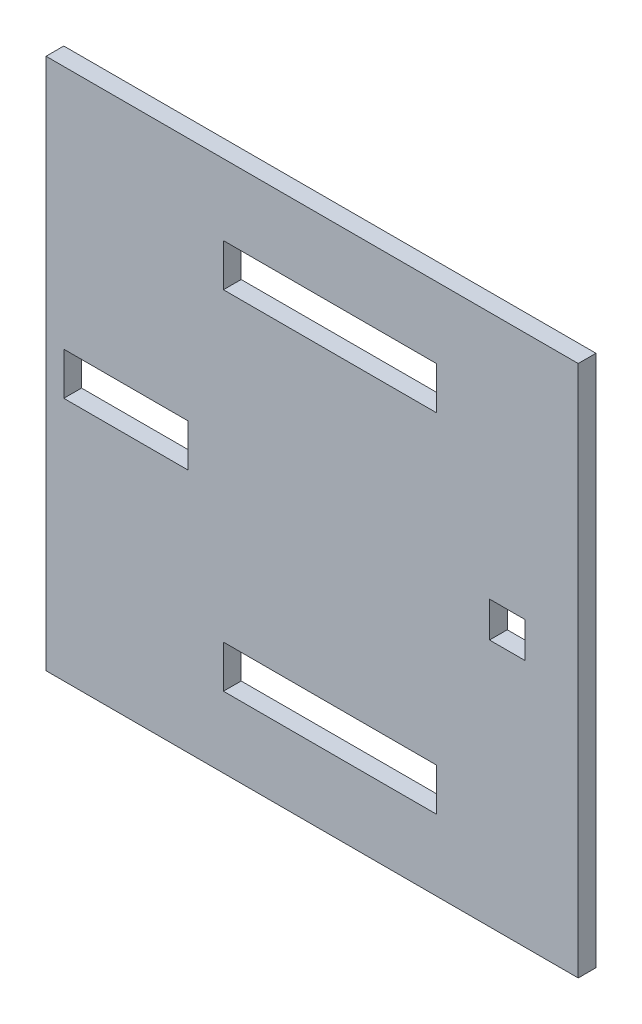
ISO-10303-21;
HEADER;
FILE_DESCRIPTION(('STEP AP214'),'2;1');
FILE_NAME('part.step','',(''),(''),'','','');
FILE_SCHEMA(('AUTOMOTIVE_DESIGN { 1 0 10303 214 1 1 1 1 }'));
ENDSEC;
DATA;
#1=APPLICATION_CONTEXT('core data for automotive mechanical design processes');
#2=APPLICATION_PROTOCOL_DEFINITION('international standard','automotive_design',2000,#1);
#3=PRODUCT_CONTEXT('',#1,'mechanical');
#4=PRODUCT('Part','Part','',(#3));
#5=PRODUCT_RELATED_PRODUCT_CATEGORY('part','',(#4));
#6=PRODUCT_DEFINITION_FORMATION('','',#4);
#7=PRODUCT_DEFINITION_CONTEXT('part definition',#1,'design');
#8=PRODUCT_DEFINITION('design','',#6,#7);
#9=PRODUCT_DEFINITION_SHAPE('','',#8);
#10=(LENGTH_UNIT() NAMED_UNIT(*) SI_UNIT(.MILLI.,.METRE.));
#11=(NAMED_UNIT(*) PLANE_ANGLE_UNIT() SI_UNIT($,.RADIAN.));
#12=(NAMED_UNIT(*) SI_UNIT($,.STERADIAN.) SOLID_ANGLE_UNIT());
#13=UNCERTAINTY_MEASURE_WITH_UNIT(LENGTH_MEASURE(1.E-05),#10,'distance_accuracy_value','');
#14=(GEOMETRIC_REPRESENTATION_CONTEXT(3) GLOBAL_UNCERTAINTY_ASSIGNED_CONTEXT((#13)) GLOBAL_UNIT_ASSIGNED_CONTEXT((#10,
#11,#12)) REPRESENTATION_CONTEXT('',''));
#15=CARTESIAN_POINT('',(0.,0.,0.));
#16=DIRECTION('',(0.,0.,1.));
#17=DIRECTION('',(1.,0.,0.));
#18=AXIS2_PLACEMENT_3D('',#15,#16,#17);
#19=CARTESIAN_POINT('',(75.,-75.,5.));
#20=DIRECTION('',(-1.,0.,0.));
#21=DIRECTION('',(0.,0.,1.));
#22=AXIS2_PLACEMENT_3D('',#19,#20,#21);
#23=PLANE('',#22);
#24=DIRECTION('',(0.,1.,0.));
#25=VECTOR('',#24,1.);
#26=CARTESIAN_POINT('',(75.,-75.,0.));
#27=LINE('',#26,#25);
#28=CARTESIAN_POINT('',(75.,-75.,0.));
#29=VERTEX_POINT('',#28);
#30=CARTESIAN_POINT('',(75.,75.,0.));
#31=VERTEX_POINT('',#30);
#32=EDGE_CURVE('E224',#29,#31,#27,.T.);
#33=ORIENTED_EDGE('',*,*,#32,.T.);
#34=DIRECTION('',(0.,0.,-1.));
#35=VECTOR('',#34,1.);
#36=CARTESIAN_POINT('',(75.,75.,5.));
#37=LINE('',#36,#35);
#38=CARTESIAN_POINT('',(75.,75.,5.));
#39=VERTEX_POINT('',#38);
#40=EDGE_CURVE('E319',#39,#31,#37,.T.);
#41=ORIENTED_EDGE('',*,*,#40,.F.);
#42=DIRECTION('',(0.,1.,0.));
#43=VECTOR('',#42,1.);
#44=CARTESIAN_POINT('',(75.,-75.,5.));
#45=LINE('',#44,#43);
#46=CARTESIAN_POINT('',(75.,-75.,5.));
#47=VERTEX_POINT('',#46);
#48=EDGE_CURVE('E293',#47,#39,#45,.T.);
#49=ORIENTED_EDGE('',*,*,#48,.F.);
#50=DIRECTION('',(0.,0.,-1.));
#51=VECTOR('',#50,1.);
#52=CARTESIAN_POINT('',(75.,-75.,5.));
#53=LINE('',#52,#51);
#54=EDGE_CURVE('E303',#47,#29,#53,.T.);
#55=ORIENTED_EDGE('',*,*,#54,.T.);
#56=EDGE_LOOP('',(#33,#41,#49,#55));
#57=FACE_BOUND('',#56,.T.);
#58=ADVANCED_FACE('F33',(#57),#23,.F.);
#59=CARTESIAN_POINT('',(-75.,75.,5.));
#60=DIRECTION('',(0.,-1.,0.));
#61=DIRECTION('',(0.,0.,-1.));
#62=AXIS2_PLACEMENT_3D('',#59,#60,#61);
#63=PLANE('',#62);
#64=DIRECTION('',(-1.,0.,0.));
#65=VECTOR('',#64,1.);
#66=CARTESIAN_POINT('',(-75.,75.,0.));
#67=LINE('',#66,#65);
#68=CARTESIAN_POINT('',(-75.,75.,0.));
#69=VERTEX_POINT('',#68);
#70=EDGE_CURVE('E306',#31,#69,#67,.T.);
#71=ORIENTED_EDGE('',*,*,#70,.T.);
#72=DIRECTION('',(0.,0.,-1.));
#73=VECTOR('',#72,1.);
#74=CARTESIAN_POINT('',(-75.,75.,5.));
#75=LINE('',#74,#73);
#76=CARTESIAN_POINT('',(-75.,75.,5.));
#77=VERTEX_POINT('',#76);
#78=EDGE_CURVE('E316',#77,#69,#75,.T.);
#79=ORIENTED_EDGE('',*,*,#78,.F.);
#80=DIRECTION('',(-1.,0.,0.));
#81=VECTOR('',#80,1.);
#82=CARTESIAN_POINT('',(-75.,75.,5.));
#83=LINE('',#82,#81);
#84=EDGE_CURVE('E296',#39,#77,#83,.T.);
#85=ORIENTED_EDGE('',*,*,#84,.F.);
#86=ORIENTED_EDGE('',*,*,#40,.T.);
#87=EDGE_LOOP('',(#71,#79,#85,#86));
#88=FACE_BOUND('',#87,.T.);
#89=ADVANCED_FACE('F347',(#88),#63,.F.);
#90=CARTESIAN_POINT('',(-75.,-75.,5.));
#91=DIRECTION('',(1.,0.,0.));
#92=DIRECTION('',(0.,0.,-1.));
#93=AXIS2_PLACEMENT_3D('',#90,#91,#92);
#94=PLANE('',#93);
#95=DIRECTION('',(0.,-1.,0.));
#96=VECTOR('',#95,1.);
#97=CARTESIAN_POINT('',(-75.,-75.,0.));
#98=LINE('',#97,#96);
#99=CARTESIAN_POINT('',(-75.,-75.,0.));
#100=VERTEX_POINT('',#99);
#101=EDGE_CURVE('E308',#69,#100,#98,.T.);
#102=ORIENTED_EDGE('',*,*,#101,.T.);
#103=DIRECTION('',(0.,0.,-1.));
#104=VECTOR('',#103,1.);
#105=CARTESIAN_POINT('',(-75.,-75.,5.));
#106=LINE('',#105,#104);
#107=CARTESIAN_POINT('',(-75.,-75.,5.));
#108=VERTEX_POINT('',#107);
#109=EDGE_CURVE('E313',#108,#100,#106,.T.);
#110=ORIENTED_EDGE('',*,*,#109,.F.);
#111=DIRECTION('',(0.,-1.,0.));
#112=VECTOR('',#111,1.);
#113=CARTESIAN_POINT('',(-75.,-75.,5.));
#114=LINE('',#113,#112);
#115=EDGE_CURVE('E299',#77,#108,#114,.T.);
#116=ORIENTED_EDGE('',*,*,#115,.F.);
#117=ORIENTED_EDGE('',*,*,#78,.T.);
#118=EDGE_LOOP('',(#102,#110,#116,#117));
#119=FACE_BOUND('',#118,.T.);
#120=ADVANCED_FACE('F352',(#119),#94,.F.);
#121=CARTESIAN_POINT('',(-75.,-75.,5.));
#122=DIRECTION('',(0.,1.,0.));
#123=DIRECTION('',(0.,0.,1.));
#124=AXIS2_PLACEMENT_3D('',#121,#122,#123);
#125=PLANE('',#124);
#126=DIRECTION('',(1.,0.,0.));
#127=VECTOR('',#126,1.);
#128=CARTESIAN_POINT('',(-75.,-75.,0.));
#129=LINE('',#128,#127);
#130=EDGE_CURVE('E297',#100,#29,#129,.T.);
#131=ORIENTED_EDGE('',*,*,#130,.T.);
#132=ORIENTED_EDGE('',*,*,#54,.F.);
#133=DIRECTION('',(1.,0.,0.));
#134=VECTOR('',#133,1.);
#135=CARTESIAN_POINT('',(-75.,-75.,5.));
#136=LINE('',#135,#134);
#137=EDGE_CURVE('E301',#108,#47,#136,.T.);
#138=ORIENTED_EDGE('',*,*,#137,.F.);
#139=ORIENTED_EDGE('',*,*,#109,.T.);
#140=EDGE_LOOP('',(#131,#132,#138,#139));
#141=FACE_BOUND('',#140,.T.);
#142=ADVANCED_FACE('F367',(#141),#125,.F.);
#143=CARTESIAN_POINT('',(0.,0.,5.));
#144=DIRECTION('',(0.,0.,-1.));
#145=DIRECTION('',(-1.,0.,0.));
#146=AXIS2_PLACEMENT_3D('',#143,#144,#145);
#147=PLANE('',#146);
#148=DIRECTION('',(-1.,0.,0.));
#149=VECTOR('',#148,1.);
#150=CARTESIAN_POINT('',(60.,4.99999999999996,5.));
#151=LINE('',#150,#149);
#152=CARTESIAN_POINT('',(60.,4.99999999999996,5.));
#153=VERTEX_POINT('',#152);
#154=CARTESIAN_POINT('',(50.,4.99999999999996,5.));
#155=VERTEX_POINT('',#154);
#156=EDGE_CURVE('E180',#153,#155,#151,.T.);
#157=ORIENTED_EDGE('',*,*,#156,.F.);
#158=DIRECTION('',(0.,1.,0.));
#159=VECTOR('',#158,1.);
#160=CARTESIAN_POINT('',(60.,4.99999999999996,5.));
#161=LINE('',#160,#159);
#162=CARTESIAN_POINT('',(60.,-5.00000000000004,5.));
#163=VERTEX_POINT('',#162);
#164=EDGE_CURVE('E47',#163,#153,#161,.T.);
#165=ORIENTED_EDGE('',*,*,#164,.F.);
#166=DIRECTION('',(1.,0.,0.));
#167=VECTOR('',#166,1.);
#168=CARTESIAN_POINT('',(60.,-5.00000000000004,5.));
#169=LINE('',#168,#167);
#170=CARTESIAN_POINT('',(50.,-5.00000000000004,5.));
#171=VERTEX_POINT('',#170);
#172=EDGE_CURVE('E187',#171,#163,#169,.T.);
#173=ORIENTED_EDGE('',*,*,#172,.F.);
#174=DIRECTION('',(0.,-1.,0.));
#175=VECTOR('',#174,1.);
#176=CARTESIAN_POINT('',(50.,4.99999999999996,5.));
#177=LINE('',#176,#175);
#178=EDGE_CURVE('E171',#155,#171,#177,.T.);
#179=ORIENTED_EDGE('',*,*,#178,.F.);
#180=EDGE_LOOP('',(#157,#165,#173,#179));
#181=FACE_BOUND('',#180,.T.);
#182=DIRECTION('',(-1.,0.,0.));
#183=VECTOR('',#182,1.);
#184=CARTESIAN_POINT('',(35.,55.,5.));
#185=LINE('',#184,#183);
#186=CARTESIAN_POINT('',(35.,55.,5.));
#187=VERTEX_POINT('',#186);
#188=CARTESIAN_POINT('',(-25.,55.,5.));
#189=VERTEX_POINT('',#188);
#190=EDGE_CURVE('E213',#187,#189,#185,.T.);
#191=ORIENTED_EDGE('',*,*,#190,.F.);
#192=DIRECTION('',(0.,1.,0.));
#193=VECTOR('',#192,1.);
#194=CARTESIAN_POINT('',(35.,55.,5.));
#195=LINE('',#194,#193);
#196=CARTESIAN_POINT('',(35.,43.,5.));
#197=VERTEX_POINT('',#196);
#198=EDGE_CURVE('E211',#197,#187,#195,.T.);
#199=ORIENTED_EDGE('',*,*,#198,.F.);
#200=DIRECTION('',(1.,0.,0.));
#201=VECTOR('',#200,1.);
#202=CARTESIAN_POINT('',(35.,43.,5.));
#203=LINE('',#202,#201);
#204=CARTESIAN_POINT('',(-25.,43.,5.));
#205=VERTEX_POINT('',#204);
#206=EDGE_CURVE('E201',#205,#197,#203,.T.);
#207=ORIENTED_EDGE('',*,*,#206,.F.);
#208=DIRECTION('',(0.,-1.,0.));
#209=VECTOR('',#208,1.);
#210=CARTESIAN_POINT('',(-25.,55.,5.));
#211=LINE('',#210,#209);
#212=EDGE_CURVE('E217',#189,#205,#211,.T.);
#213=ORIENTED_EDGE('',*,*,#212,.F.);
#214=EDGE_LOOP('',(#191,#199,#207,#213));
#215=FACE_BOUND('',#214,.T.);
#216=DIRECTION('',(-1.,0.,0.));
#217=VECTOR('',#216,1.);
#218=CARTESIAN_POINT('',(35.,-43.,5.));
#219=LINE('',#218,#217);
#220=CARTESIAN_POINT('',(35.,-43.,5.));
#221=VERTEX_POINT('',#220);
#222=CARTESIAN_POINT('',(-25.,-43.,5.));
#223=VERTEX_POINT('',#222);
#224=EDGE_CURVE('E247',#221,#223,#219,.T.);
#225=ORIENTED_EDGE('',*,*,#224,.F.);
#226=DIRECTION('',(0.,1.,0.));
#227=VECTOR('',#226,1.);
#228=CARTESIAN_POINT('',(35.,-43.,5.));
#229=LINE('',#228,#227);
#230=CARTESIAN_POINT('',(35.,-55.,5.));
#231=VERTEX_POINT('',#230);
#232=EDGE_CURVE('E245',#231,#221,#229,.T.);
#233=ORIENTED_EDGE('',*,*,#232,.F.);
#234=DIRECTION('',(1.,0.,0.));
#235=VECTOR('',#234,1.);
#236=CARTESIAN_POINT('',(35.,-55.,5.));
#237=LINE('',#236,#235);
#238=CARTESIAN_POINT('',(-25.,-55.,5.));
#239=VERTEX_POINT('',#238);
#240=EDGE_CURVE('E235',#239,#231,#237,.T.);
#241=ORIENTED_EDGE('',*,*,#240,.F.);
#242=DIRECTION('',(0.,-1.,0.));
#243=VECTOR('',#242,1.);
#244=CARTESIAN_POINT('',(-25.,-43.,5.));
#245=LINE('',#244,#243);
#246=EDGE_CURVE('E251',#223,#239,#245,.T.);
#247=ORIENTED_EDGE('',*,*,#246,.F.);
#248=EDGE_LOOP('',(#225,#233,#241,#247));
#249=FACE_BOUND('',#248,.T.);
#250=DIRECTION('',(-1.,0.,0.));
#251=VECTOR('',#250,1.);
#252=CARTESIAN_POINT('',(-35.,5.99999999999998,5.));
#253=LINE('',#252,#251);
#254=CARTESIAN_POINT('',(-35.,5.99999999999998,5.));
#255=VERTEX_POINT('',#254);
#256=CARTESIAN_POINT('',(-70.,5.99999999999997,5.));
#257=VERTEX_POINT('',#256);
#258=EDGE_CURVE('E278',#255,#257,#253,.T.);
#259=ORIENTED_EDGE('',*,*,#258,.F.);
#260=DIRECTION('',(0.,1.,0.));
#261=VECTOR('',#260,1.);
#262=CARTESIAN_POINT('',(-35.,5.99999999999998,5.));
#263=LINE('',#262,#261);
#264=CARTESIAN_POINT('',(-35.,-6.00000000000002,5.));
#265=VERTEX_POINT('',#264);
#266=EDGE_CURVE('E194',#265,#255,#263,.T.);
#267=ORIENTED_EDGE('',*,*,#266,.F.);
#268=DIRECTION('',(1.,0.,0.));
#269=VECTOR('',#268,1.);
#270=CARTESIAN_POINT('',(-35.,-6.00000000000002,5.));
#271=LINE('',#270,#269);
#272=CARTESIAN_POINT('',(-70.,-6.00000000000003,5.));
#273=VERTEX_POINT('',#272);
#274=EDGE_CURVE('E267',#273,#265,#271,.T.);
#275=ORIENTED_EDGE('',*,*,#274,.F.);
#276=DIRECTION('',(0.,-1.,0.));
#277=VECTOR('',#276,1.);
#278=CARTESIAN_POINT('',(-70.,5.99999999999997,5.));
#279=LINE('',#278,#277);
#280=EDGE_CURVE('E281',#257,#273,#279,.T.);
#281=ORIENTED_EDGE('',*,*,#280,.F.);
#282=EDGE_LOOP('',(#259,#267,#275,#281));
#283=FACE_BOUND('',#282,.T.);
#284=ORIENTED_EDGE('',*,*,#48,.T.);
#285=ORIENTED_EDGE('',*,*,#84,.T.);
#286=ORIENTED_EDGE('',*,*,#115,.T.);
#287=ORIENTED_EDGE('',*,*,#137,.T.);
#288=EDGE_LOOP('',(#284,#285,#286,#287));
#289=FACE_BOUND('',#288,.T.);
#290=ADVANCED_FACE('F184',(#181,#215,#249,#283,#289),#147,.F.);
#291=CARTESIAN_POINT('',(0.,0.,0.));
#292=DIRECTION('',(0.,0.,-1.));
#293=DIRECTION('',(-1.,0.,0.));
#294=AXIS2_PLACEMENT_3D('',#291,#292,#293);
#295=PLANE('',#294);
#296=DIRECTION('',(0.,-1.,0.));
#297=VECTOR('',#296,1.);
#298=CARTESIAN_POINT('',(60.,0.,0.));
#299=LINE('',#298,#297);
#300=CARTESIAN_POINT('',(60.,4.99999999999996,0.));
#301=VERTEX_POINT('',#300);
#302=CARTESIAN_POINT('',(60.,-5.00000000000004,0.));
#303=VERTEX_POINT('',#302);
#304=EDGE_CURVE('E11',#301,#303,#299,.T.);
#305=ORIENTED_EDGE('',*,*,#304,.F.);
#306=DIRECTION('',(1.,0.,0.));
#307=VECTOR('',#306,1.);
#308=CARTESIAN_POINT('',(0.,4.99999999999996,0.));
#309=LINE('',#308,#307);
#310=CARTESIAN_POINT('',(50.,4.99999999999996,0.));
#311=VERTEX_POINT('',#310);
#312=EDGE_CURVE('E322',#311,#301,#309,.T.);
#313=ORIENTED_EDGE('',*,*,#312,.F.);
#314=DIRECTION('',(0.,1.,0.));
#315=VECTOR('',#314,1.);
#316=CARTESIAN_POINT('',(50.,0.,0.));
#317=LINE('',#316,#315);
#318=CARTESIAN_POINT('',(50.,-5.00000000000004,0.));
#319=VERTEX_POINT('',#318);
#320=EDGE_CURVE('E174',#319,#311,#317,.T.);
#321=ORIENTED_EDGE('',*,*,#320,.F.);
#322=DIRECTION('',(-1.,0.,0.));
#323=VECTOR('',#322,1.);
#324=CARTESIAN_POINT('',(0.,-5.00000000000004,0.));
#325=LINE('',#324,#323);
#326=EDGE_CURVE('E40',#303,#319,#325,.T.);
#327=ORIENTED_EDGE('',*,*,#326,.F.);
#328=EDGE_LOOP('',(#305,#313,#321,#327));
#329=FACE_BOUND('',#328,.T.);
#330=DIRECTION('',(0.,1.,0.));
#331=VECTOR('',#330,1.);
#332=CARTESIAN_POINT('',(35.,55.,0.));
#333=LINE('',#332,#331);
#334=CARTESIAN_POINT('',(35.,43.,0.));
#335=VERTEX_POINT('',#334);
#336=CARTESIAN_POINT('',(35.,55.,0.));
#337=VERTEX_POINT('',#336);
#338=EDGE_CURVE('E197',#335,#337,#333,.T.);
#339=ORIENTED_EDGE('',*,*,#338,.T.);
#340=DIRECTION('',(-1.,0.,0.));
#341=VECTOR('',#340,1.);
#342=CARTESIAN_POINT('',(35.,55.,0.));
#343=LINE('',#342,#341);
#344=CARTESIAN_POINT('',(-25.,55.,0.));
#345=VERTEX_POINT('',#344);
#346=EDGE_CURVE('E200',#337,#345,#343,.T.);
#347=ORIENTED_EDGE('',*,*,#346,.T.);
#348=DIRECTION('',(0.,-1.,0.));
#349=VECTOR('',#348,1.);
#350=CARTESIAN_POINT('',(-25.,55.,0.));
#351=LINE('',#350,#349);
#352=CARTESIAN_POINT('',(-25.,43.,0.));
#353=VERTEX_POINT('',#352);
#354=EDGE_CURVE('E204',#345,#353,#351,.T.);
#355=ORIENTED_EDGE('',*,*,#354,.T.);
#356=DIRECTION('',(1.,0.,0.));
#357=VECTOR('',#356,1.);
#358=CARTESIAN_POINT('',(35.,43.,0.));
#359=LINE('',#358,#357);
#360=EDGE_CURVE('E207',#353,#335,#359,.T.);
#361=ORIENTED_EDGE('',*,*,#360,.T.);
#362=EDGE_LOOP('',(#339,#347,#355,#361));
#363=FACE_BOUND('',#362,.T.);
#364=DIRECTION('',(0.,1.,0.));
#365=VECTOR('',#364,1.);
#366=CARTESIAN_POINT('',(35.,-43.,0.));
#367=LINE('',#366,#365);
#368=CARTESIAN_POINT('',(35.,-55.,0.));
#369=VERTEX_POINT('',#368);
#370=CARTESIAN_POINT('',(35.,-43.,0.));
#371=VERTEX_POINT('',#370);
#372=EDGE_CURVE('E231',#369,#371,#367,.T.);
#373=ORIENTED_EDGE('',*,*,#372,.T.);
#374=DIRECTION('',(-1.,0.,0.));
#375=VECTOR('',#374,1.);
#376=CARTESIAN_POINT('',(35.,-43.,0.));
#377=LINE('',#376,#375);
#378=CARTESIAN_POINT('',(-25.,-43.,0.));
#379=VERTEX_POINT('',#378);
#380=EDGE_CURVE('E234',#371,#379,#377,.T.);
#381=ORIENTED_EDGE('',*,*,#380,.T.);
#382=DIRECTION('',(0.,-1.,0.));
#383=VECTOR('',#382,1.);
#384=CARTESIAN_POINT('',(-25.,-43.,0.));
#385=LINE('',#384,#383);
#386=CARTESIAN_POINT('',(-25.,-55.,0.));
#387=VERTEX_POINT('',#386);
#388=EDGE_CURVE('E238',#379,#387,#385,.T.);
#389=ORIENTED_EDGE('',*,*,#388,.T.);
#390=DIRECTION('',(1.,0.,0.));
#391=VECTOR('',#390,1.);
#392=CARTESIAN_POINT('',(35.,-55.,0.));
#393=LINE('',#392,#391);
#394=EDGE_CURVE('E241',#387,#369,#393,.T.);
#395=ORIENTED_EDGE('',*,*,#394,.T.);
#396=EDGE_LOOP('',(#373,#381,#389,#395));
#397=FACE_BOUND('',#396,.T.);
#398=DIRECTION('',(0.,1.,0.));
#399=VECTOR('',#398,1.);
#400=CARTESIAN_POINT('',(-35.,5.99999999999998,0.));
#401=LINE('',#400,#399);
#402=CARTESIAN_POINT('',(-35.,-6.00000000000002,0.));
#403=VERTEX_POINT('',#402);
#404=CARTESIAN_POINT('',(-35.,5.99999999999998,0.));
#405=VERTEX_POINT('',#404);
#406=EDGE_CURVE('E263',#403,#405,#401,.T.);
#407=ORIENTED_EDGE('',*,*,#406,.T.);
#408=DIRECTION('',(-1.,0.,0.));
#409=VECTOR('',#408,1.);
#410=CARTESIAN_POINT('',(-35.,5.99999999999998,0.));
#411=LINE('',#410,#409);
#412=CARTESIAN_POINT('',(-70.,5.99999999999997,0.));
#413=VERTEX_POINT('',#412);
#414=EDGE_CURVE('E266',#405,#413,#411,.T.);
#415=ORIENTED_EDGE('',*,*,#414,.T.);
#416=DIRECTION('',(0.,-1.,0.));
#417=VECTOR('',#416,1.);
#418=CARTESIAN_POINT('',(-70.,5.99999999999997,0.));
#419=LINE('',#418,#417);
#420=CARTESIAN_POINT('',(-70.,-6.00000000000003,0.));
#421=VERTEX_POINT('',#420);
#422=EDGE_CURVE('E270',#413,#421,#419,.T.);
#423=ORIENTED_EDGE('',*,*,#422,.T.);
#424=DIRECTION('',(1.,0.,0.));
#425=VECTOR('',#424,1.);
#426=CARTESIAN_POINT('',(-35.,-6.00000000000002,0.));
#427=LINE('',#426,#425);
#428=EDGE_CURVE('E273',#421,#403,#427,.T.);
#429=ORIENTED_EDGE('',*,*,#428,.T.);
#430=EDGE_LOOP('',(#407,#415,#423,#429));
#431=FACE_BOUND('',#430,.T.);
#432=ORIENTED_EDGE('',*,*,#32,.F.);
#433=ORIENTED_EDGE('',*,*,#130,.F.);
#434=ORIENTED_EDGE('',*,*,#101,.F.);
#435=ORIENTED_EDGE('',*,*,#70,.F.);
#436=EDGE_LOOP('',(#432,#433,#434,#435));
#437=FACE_BOUND('',#436,.T.);
#438=ADVANCED_FACE('F330',(#329,#363,#397,#431,#437),#295,.T.);
#439=CARTESIAN_POINT('',(-35.,5.99999999999998,0.));
#440=DIRECTION('',(1.,0.,0.));
#441=DIRECTION('',(0.,0.,-1.));
#442=AXIS2_PLACEMENT_3D('',#439,#440,#441);
#443=PLANE('',#442);
#444=ORIENTED_EDGE('',*,*,#266,.T.);
#445=DIRECTION('',(0.,0.,1.));
#446=VECTOR('',#445,1.);
#447=CARTESIAN_POINT('',(-35.,5.99999999999998,0.));
#448=LINE('',#447,#446);
#449=EDGE_CURVE('E276',#405,#255,#448,.T.);
#450=ORIENTED_EDGE('',*,*,#449,.F.);
#451=ORIENTED_EDGE('',*,*,#406,.F.);
#452=DIRECTION('',(0.,0.,1.));
#453=VECTOR('',#452,1.);
#454=CARTESIAN_POINT('',(-35.,-6.00000000000002,0.));
#455=LINE('',#454,#453);
#456=EDGE_CURVE('E248',#403,#265,#455,.T.);
#457=ORIENTED_EDGE('',*,*,#456,.T.);
#458=EDGE_LOOP('',(#444,#450,#451,#457));
#459=FACE_BOUND('',#458,.T.);
#460=ADVANCED_FACE('F378',(#459),#443,.F.);
#461=CARTESIAN_POINT('',(-35.,-6.00000000000002,0.));
#462=DIRECTION('',(0.,-1.,0.));
#463=DIRECTION('',(1.,0.,0.));
#464=AXIS2_PLACEMENT_3D('',#461,#462,#463);
#465=PLANE('',#464);
#466=ORIENTED_EDGE('',*,*,#274,.T.);
#467=ORIENTED_EDGE('',*,*,#456,.F.);
#468=ORIENTED_EDGE('',*,*,#428,.F.);
#469=DIRECTION('',(0.,0.,1.));
#470=VECTOR('',#469,1.);
#471=CARTESIAN_POINT('',(-70.,-6.00000000000003,0.));
#472=LINE('',#471,#470);
#473=EDGE_CURVE('E287',#421,#273,#472,.T.);
#474=ORIENTED_EDGE('',*,*,#473,.T.);
#475=EDGE_LOOP('',(#466,#467,#468,#474));
#476=FACE_BOUND('',#475,.T.);
#477=ADVANCED_FACE('F383',(#476),#465,.F.);
#478=CARTESIAN_POINT('',(-70.,5.99999999999997,0.));
#479=DIRECTION('',(-1.,0.,0.));
#480=DIRECTION('',(0.,0.,1.));
#481=AXIS2_PLACEMENT_3D('',#478,#479,#480);
#482=PLANE('',#481);
#483=ORIENTED_EDGE('',*,*,#280,.T.);
#484=ORIENTED_EDGE('',*,*,#473,.F.);
#485=ORIENTED_EDGE('',*,*,#422,.F.);
#486=DIRECTION('',(0.,0.,1.));
#487=VECTOR('',#486,1.);
#488=CARTESIAN_POINT('',(-70.,5.99999999999997,0.));
#489=LINE('',#488,#487);
#490=EDGE_CURVE('E289',#413,#257,#489,.T.);
#491=ORIENTED_EDGE('',*,*,#490,.T.);
#492=EDGE_LOOP('',(#483,#484,#485,#491));
#493=FACE_BOUND('',#492,.T.);
#494=ADVANCED_FACE('F389',(#493),#482,.F.);
#495=CARTESIAN_POINT('',(-35.,5.99999999999998,0.));
#496=DIRECTION('',(0.,1.,0.));
#497=DIRECTION('',(-1.,0.,0.));
#498=AXIS2_PLACEMENT_3D('',#495,#496,#497);
#499=PLANE('',#498);
#500=ORIENTED_EDGE('',*,*,#258,.T.);
#501=ORIENTED_EDGE('',*,*,#490,.F.);
#502=ORIENTED_EDGE('',*,*,#414,.F.);
#503=ORIENTED_EDGE('',*,*,#449,.T.);
#504=EDGE_LOOP('',(#500,#501,#502,#503));
#505=FACE_BOUND('',#504,.T.);
#506=ADVANCED_FACE('F385',(#505),#499,.F.);
#507=CARTESIAN_POINT('',(35.,-43.,0.));
#508=DIRECTION('',(1.,0.,0.));
#509=DIRECTION('',(0.,0.,-1.));
#510=AXIS2_PLACEMENT_3D('',#507,#508,#509);
#511=PLANE('',#510);
#512=ORIENTED_EDGE('',*,*,#232,.T.);
#513=DIRECTION('',(0.,0.,1.));
#514=VECTOR('',#513,1.);
#515=CARTESIAN_POINT('',(35.,-43.,0.));
#516=LINE('',#515,#514);
#517=EDGE_CURVE('E244',#371,#221,#516,.T.);
#518=ORIENTED_EDGE('',*,*,#517,.F.);
#519=ORIENTED_EDGE('',*,*,#372,.F.);
#520=DIRECTION('',(0.,0.,1.));
#521=VECTOR('',#520,1.);
#522=CARTESIAN_POINT('',(35.,-55.,0.));
#523=LINE('',#522,#521);
#524=EDGE_CURVE('E214',#369,#231,#523,.T.);
#525=ORIENTED_EDGE('',*,*,#524,.T.);
#526=EDGE_LOOP('',(#512,#518,#519,#525));
#527=FACE_BOUND('',#526,.T.);
#528=ADVANCED_FACE('F388',(#527),#511,.F.);
#529=CARTESIAN_POINT('',(35.,-55.,0.));
#530=DIRECTION('',(0.,-1.,0.));
#531=DIRECTION('',(1.,0.,0.));
#532=AXIS2_PLACEMENT_3D('',#529,#530,#531);
#533=PLANE('',#532);
#534=ORIENTED_EDGE('',*,*,#240,.T.);
#535=ORIENTED_EDGE('',*,*,#524,.F.);
#536=ORIENTED_EDGE('',*,*,#394,.F.);
#537=DIRECTION('',(0.,0.,1.));
#538=VECTOR('',#537,1.);
#539=CARTESIAN_POINT('',(-25.,-55.,0.));
#540=LINE('',#539,#538);
#541=EDGE_CURVE('E257',#387,#239,#540,.T.);
#542=ORIENTED_EDGE('',*,*,#541,.T.);
#543=EDGE_LOOP('',(#534,#535,#536,#542));
#544=FACE_BOUND('',#543,.T.);
#545=ADVANCED_FACE('F399',(#544),#533,.F.);
#546=CARTESIAN_POINT('',(-25.,-43.,0.));
#547=DIRECTION('',(-1.,0.,0.));
#548=DIRECTION('',(0.,0.,1.));
#549=AXIS2_PLACEMENT_3D('',#546,#547,#548);
#550=PLANE('',#549);
#551=ORIENTED_EDGE('',*,*,#246,.T.);
#552=ORIENTED_EDGE('',*,*,#541,.F.);
#553=ORIENTED_EDGE('',*,*,#388,.F.);
#554=DIRECTION('',(0.,0.,1.));
#555=VECTOR('',#554,1.);
#556=CARTESIAN_POINT('',(-25.,-43.,0.));
#557=LINE('',#556,#555);
#558=EDGE_CURVE('E259',#379,#223,#557,.T.);
#559=ORIENTED_EDGE('',*,*,#558,.T.);
#560=EDGE_LOOP('',(#551,#552,#553,#559));
#561=FACE_BOUND('',#560,.T.);
#562=ADVANCED_FACE('F405',(#561),#550,.F.);
#563=CARTESIAN_POINT('',(35.,-43.,0.));
#564=DIRECTION('',(0.,1.,0.));
#565=DIRECTION('',(-1.,0.,0.));
#566=AXIS2_PLACEMENT_3D('',#563,#564,#565);
#567=PLANE('',#566);
#568=ORIENTED_EDGE('',*,*,#224,.T.);
#569=ORIENTED_EDGE('',*,*,#558,.F.);
#570=ORIENTED_EDGE('',*,*,#380,.F.);
#571=ORIENTED_EDGE('',*,*,#517,.T.);
#572=EDGE_LOOP('',(#568,#569,#570,#571));
#573=FACE_BOUND('',#572,.T.);
#574=ADVANCED_FACE('F401',(#573),#567,.F.);
#575=CARTESIAN_POINT('',(35.,55.,0.));
#576=DIRECTION('',(1.,0.,0.));
#577=DIRECTION('',(0.,1.,0.));
#578=AXIS2_PLACEMENT_3D('',#575,#576,#577);
#579=PLANE('',#578);
#580=ORIENTED_EDGE('',*,*,#198,.T.);
#581=DIRECTION('',(0.,0.,1.));
#582=VECTOR('',#581,1.);
#583=CARTESIAN_POINT('',(35.,55.,0.));
#584=LINE('',#583,#582);
#585=EDGE_CURVE('E210',#337,#187,#584,.T.);
#586=ORIENTED_EDGE('',*,*,#585,.F.);
#587=ORIENTED_EDGE('',*,*,#338,.F.);
#588=DIRECTION('',(0.,0.,1.));
#589=VECTOR('',#588,1.);
#590=CARTESIAN_POINT('',(35.,43.,0.));
#591=LINE('',#590,#589);
#592=EDGE_CURVE('E222',#335,#197,#591,.T.);
#593=ORIENTED_EDGE('',*,*,#592,.T.);
#594=EDGE_LOOP('',(#580,#586,#587,#593));
#595=FACE_BOUND('',#594,.T.);
#596=ADVANCED_FACE('F404',(#595),#579,.F.);
#597=CARTESIAN_POINT('',(35.,43.,0.));
#598=DIRECTION('',(0.,-1.,0.));
#599=DIRECTION('',(1.,0.,0.));
#600=AXIS2_PLACEMENT_3D('',#597,#598,#599);
#601=PLANE('',#600);
#602=ORIENTED_EDGE('',*,*,#206,.T.);
#603=ORIENTED_EDGE('',*,*,#592,.F.);
#604=ORIENTED_EDGE('',*,*,#360,.F.);
#605=DIRECTION('',(0.,0.,1.));
#606=VECTOR('',#605,1.);
#607=CARTESIAN_POINT('',(-25.,43.,0.));
#608=LINE('',#607,#606);
#609=EDGE_CURVE('E225',#353,#205,#608,.T.);
#610=ORIENTED_EDGE('',*,*,#609,.T.);
#611=EDGE_LOOP('',(#602,#603,#604,#610));
#612=FACE_BOUND('',#611,.T.);
#613=ADVANCED_FACE('F414',(#612),#601,.F.);
#614=CARTESIAN_POINT('',(-25.,55.,0.));
#615=DIRECTION('',(-1.,0.,0.));
#616=DIRECTION('',(0.,0.,1.));
#617=AXIS2_PLACEMENT_3D('',#614,#615,#616);
#618=PLANE('',#617);
#619=ORIENTED_EDGE('',*,*,#212,.T.);
#620=ORIENTED_EDGE('',*,*,#609,.F.);
#621=ORIENTED_EDGE('',*,*,#354,.F.);
#622=DIRECTION('',(0.,0.,1.));
#623=VECTOR('',#622,1.);
#624=CARTESIAN_POINT('',(-25.,55.,0.));
#625=LINE('',#624,#623);
#626=EDGE_CURVE('E227',#345,#189,#625,.T.);
#627=ORIENTED_EDGE('',*,*,#626,.T.);
#628=EDGE_LOOP('',(#619,#620,#621,#627));
#629=FACE_BOUND('',#628,.T.);
#630=ADVANCED_FACE('F341',(#629),#618,.F.);
#631=CARTESIAN_POINT('',(35.,55.,0.));
#632=DIRECTION('',(0.,1.,0.));
#633=DIRECTION('',(-1.,0.,0.));
#634=AXIS2_PLACEMENT_3D('',#631,#632,#633);
#635=PLANE('',#634);
#636=ORIENTED_EDGE('',*,*,#190,.T.);
#637=ORIENTED_EDGE('',*,*,#626,.F.);
#638=ORIENTED_EDGE('',*,*,#346,.F.);
#639=ORIENTED_EDGE('',*,*,#585,.T.);
#640=EDGE_LOOP('',(#636,#637,#638,#639));
#641=FACE_BOUND('',#640,.T.);
#642=ADVANCED_FACE('F334',(#641),#635,.F.);
#643=CARTESIAN_POINT('',(60.,4.99999999999996,-5.));
#644=DIRECTION('',(1.,0.,0.));
#645=DIRECTION('',(0.,0.,-1.));
#646=AXIS2_PLACEMENT_3D('',#643,#644,#645);
#647=PLANE('',#646);
#648=ORIENTED_EDGE('',*,*,#304,.T.);
#649=DIRECTION('',(0.,0.,1.));
#650=VECTOR('',#649,1.);
#651=CARTESIAN_POINT('',(60.,-5.00000000000004,-5.));
#652=LINE('',#651,#650);
#653=EDGE_CURVE('E192',#303,#163,#652,.T.);
#654=ORIENTED_EDGE('',*,*,#653,.T.);
#655=ORIENTED_EDGE('',*,*,#164,.T.);
#656=DIRECTION('',(0.,0.,1.));
#657=VECTOR('',#656,1.);
#658=CARTESIAN_POINT('',(60.,4.99999999999996,-5.));
#659=LINE('',#658,#657);
#660=EDGE_CURVE('E177',#301,#153,#659,.T.);
#661=ORIENTED_EDGE('',*,*,#660,.F.);
#662=EDGE_LOOP('',(#648,#654,#655,#661));
#663=FACE_BOUND('',#662,.T.);
#664=ADVANCED_FACE('F332',(#663),#647,.F.);
#665=CARTESIAN_POINT('',(60.,-5.00000000000004,-5.));
#666=DIRECTION('',(0.,-1.,0.));
#667=DIRECTION('',(1.,0.,0.));
#668=AXIS2_PLACEMENT_3D('',#665,#666,#667);
#669=PLANE('',#668);
#670=ORIENTED_EDGE('',*,*,#326,.T.);
#671=DIRECTION('',(0.,0.,1.));
#672=VECTOR('',#671,1.);
#673=CARTESIAN_POINT('',(50.,-5.00000000000004,-5.));
#674=LINE('',#673,#672);
#675=EDGE_CURVE('E176',#319,#171,#674,.T.);
#676=ORIENTED_EDGE('',*,*,#675,.T.);
#677=ORIENTED_EDGE('',*,*,#172,.T.);
#678=ORIENTED_EDGE('',*,*,#653,.F.);
#679=EDGE_LOOP('',(#670,#676,#677,#678));
#680=FACE_BOUND('',#679,.T.);
#681=ADVANCED_FACE('F327',(#680),#669,.F.);
#682=CARTESIAN_POINT('',(50.,4.99999999999996,-5.));
#683=DIRECTION('',(-1.,0.,0.));
#684=DIRECTION('',(0.,0.,1.));
#685=AXIS2_PLACEMENT_3D('',#682,#683,#684);
#686=PLANE('',#685);
#687=ORIENTED_EDGE('',*,*,#320,.T.);
#688=DIRECTION('',(0.,0.,1.));
#689=VECTOR('',#688,1.);
#690=CARTESIAN_POINT('',(50.,4.99999999999996,-5.));
#691=LINE('',#690,#689);
#692=EDGE_CURVE('E55',#311,#155,#691,.T.);
#693=ORIENTED_EDGE('',*,*,#692,.T.);
#694=ORIENTED_EDGE('',*,*,#178,.T.);
#695=ORIENTED_EDGE('',*,*,#675,.F.);
#696=EDGE_LOOP('',(#687,#693,#694,#695));
#697=FACE_BOUND('',#696,.T.);
#698=ADVANCED_FACE('F168',(#697),#686,.F.);
#699=CARTESIAN_POINT('',(60.,4.99999999999996,-5.));
#700=DIRECTION('',(0.,1.,0.));
#701=DIRECTION('',(-1.,0.,0.));
#702=AXIS2_PLACEMENT_3D('',#699,#700,#701);
#703=PLANE('',#702);
#704=ORIENTED_EDGE('',*,*,#312,.T.);
#705=ORIENTED_EDGE('',*,*,#660,.T.);
#706=ORIENTED_EDGE('',*,*,#156,.T.);
#707=ORIENTED_EDGE('',*,*,#692,.F.);
#708=EDGE_LOOP('',(#704,#705,#706,#707));
#709=FACE_BOUND('',#708,.T.);
#710=ADVANCED_FACE('F181',(#709),#703,.F.);
#711=CLOSED_SHELL('',(#58,#89,#120,#142,#290,#438,#460,#477,#494,#506,#528,#545,#562,#574,#596,
#613,#630,#642,#664,#681,#698,#710));
#712=MANIFOLD_SOLID_BREP('B2',#711);
#713=ADVANCED_BREP_SHAPE_REPRESENTATION('',(#18,#712),#14);
#714=SHAPE_DEFINITION_REPRESENTATION(#9,#713);
ENDSEC;
END-ISO-10303-21;
